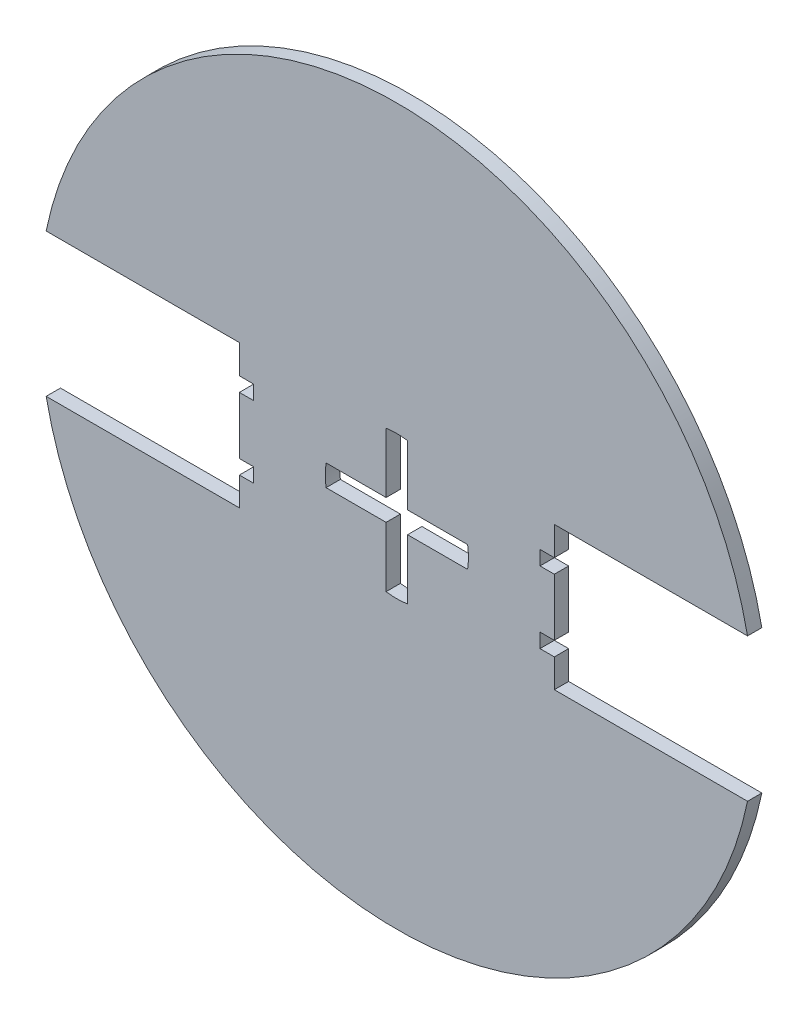
ISO-10303-21;
HEADER;
FILE_DESCRIPTION(('STEP AP214'),'2;1');
FILE_NAME('part.step','',(''),(''),'','','');
FILE_SCHEMA(('AUTOMOTIVE_DESIGN { 1 0 10303 214 1 1 1 1 }'));
ENDSEC;
DATA;
#1=APPLICATION_CONTEXT('core data for automotive mechanical design processes');
#2=APPLICATION_PROTOCOL_DEFINITION('international standard','automotive_design',2000,#1);
#3=PRODUCT_CONTEXT('',#1,'mechanical');
#4=PRODUCT('Part','Part','',(#3));
#5=PRODUCT_RELATED_PRODUCT_CATEGORY('part','',(#4));
#6=PRODUCT_DEFINITION_FORMATION('','',#4);
#7=PRODUCT_DEFINITION_CONTEXT('part definition',#1,'design');
#8=PRODUCT_DEFINITION('design','',#6,#7);
#9=PRODUCT_DEFINITION_SHAPE('','',#8);
#10=(LENGTH_UNIT() NAMED_UNIT(*) SI_UNIT(.MILLI.,.METRE.));
#11=(NAMED_UNIT(*) PLANE_ANGLE_UNIT() SI_UNIT($,.RADIAN.));
#12=(NAMED_UNIT(*) SI_UNIT($,.STERADIAN.) SOLID_ANGLE_UNIT());
#13=UNCERTAINTY_MEASURE_WITH_UNIT(LENGTH_MEASURE(1.E-05),#10,'distance_accuracy_value','');
#14=(GEOMETRIC_REPRESENTATION_CONTEXT(3) GLOBAL_UNCERTAINTY_ASSIGNED_CONTEXT((#13)) GLOBAL_UNIT_ASSIGNED_CONTEXT((#10,
#11,#12)) REPRESENTATION_CONTEXT('',''));
#15=CARTESIAN_POINT('',(0.,0.,0.));
#16=DIRECTION('',(0.,0.,1.));
#17=DIRECTION('',(1.,0.,0.));
#18=AXIS2_PLACEMENT_3D('',#15,#16,#17);
#19=CARTESIAN_POINT('',(22.,0.,-2.));
#20=DIRECTION('',(-1.,0.,0.));
#21=DIRECTION('',(0.,0.,1.));
#22=AXIS2_PLACEMENT_3D('',#19,#20,#21);
#23=PLANE('',#22);
#24=DIRECTION('',(0.,0.,1.));
#25=VECTOR('',#24,1.);
#26=CARTESIAN_POINT('',(22.,5.97280954344829,-2.));
#27=LINE('',#26,#25);
#28=CARTESIAN_POINT('',(22.,5.97280954344829,-2.));
#29=VERTEX_POINT('',#28);
#30=CARTESIAN_POINT('',(22.,5.97280954344829,0.));
#31=VERTEX_POINT('',#30);
#32=EDGE_CURVE('E531',#29,#31,#27,.T.);
#33=ORIENTED_EDGE('',*,*,#32,.F.);
#34=DIRECTION('',(0.,-1.,0.));
#35=VECTOR('',#34,1.);
#36=CARTESIAN_POINT('',(22.,0.,-2.));
#37=LINE('',#36,#35);
#38=CARTESIAN_POINT('',(22.,10.,-2.));
#39=VERTEX_POINT('',#38);
#40=EDGE_CURVE('E291',#39,#29,#37,.T.);
#41=ORIENTED_EDGE('',*,*,#40,.F.);
#42=DIRECTION('',(0.,0.,1.));
#43=VECTOR('',#42,1.);
#44=CARTESIAN_POINT('',(22.,10.,-2.));
#45=LINE('',#44,#43);
#46=CARTESIAN_POINT('',(22.,10.,0.));
#47=VERTEX_POINT('',#46);
#48=EDGE_CURVE('E372',#39,#47,#45,.T.);
#49=ORIENTED_EDGE('',*,*,#48,.T.);
#50=DIRECTION('',(0.,-1.,0.));
#51=VECTOR('',#50,1.);
#52=CARTESIAN_POINT('',(22.,0.,0.));
#53=LINE('',#52,#51);
#54=EDGE_CURVE('E354',#47,#31,#53,.T.);
#55=ORIENTED_EDGE('',*,*,#54,.T.);
#56=EDGE_LOOP('',(#33,#41,#49,#55));
#57=FACE_BOUND('',#56,.T.);
#58=ADVANCED_FACE('F38',(#57),#23,.F.);
#59=CARTESIAN_POINT('',(22.,3.97280954344829,-2.));
#60=VERTEX_POINT('',#59);
#61=CARTESIAN_POINT('',(22.,-4.02811773443487,-2.));
#62=VERTEX_POINT('',#61);
#63=EDGE_CURVE('E359',#60,#62,#37,.T.);
#64=ORIENTED_EDGE('',*,*,#63,.F.);
#65=DIRECTION('',(0.,0.,1.));
#66=VECTOR('',#65,1.);
#67=CARTESIAN_POINT('',(22.,3.97280954344829,-2.));
#68=LINE('',#67,#66);
#69=CARTESIAN_POINT('',(22.,3.97280954344829,0.));
#70=VERTEX_POINT('',#69);
#71=EDGE_CURVE('E533',#60,#70,#68,.T.);
#72=ORIENTED_EDGE('',*,*,#71,.T.);
#73=CARTESIAN_POINT('',(22.,-4.02811773443487,0.));
#74=VERTEX_POINT('',#73);
#75=EDGE_CURVE('E367',#70,#74,#53,.T.);
#76=ORIENTED_EDGE('',*,*,#75,.T.);
#77=DIRECTION('',(0.,0.,1.));
#78=VECTOR('',#77,1.);
#79=CARTESIAN_POINT('',(22.,-4.02811773443487,-2.));
#80=LINE('',#79,#78);
#81=EDGE_CURVE('E526',#62,#74,#80,.T.);
#82=ORIENTED_EDGE('',*,*,#81,.F.);
#83=EDGE_LOOP('',(#64,#72,#76,#82));
#84=FACE_BOUND('',#83,.T.);
#85=ADVANCED_FACE('F622',(#84),#23,.F.);
#86=CARTESIAN_POINT('',(-22.,0.,-2.));
#87=DIRECTION('',(-1.,0.,0.));
#88=DIRECTION('',(0.,0.,1.));
#89=AXIS2_PLACEMENT_3D('',#86,#87,#88);
#90=PLANE('',#89);
#91=DIRECTION('',(0.,-1.,0.));
#92=VECTOR('',#91,1.);
#93=CARTESIAN_POINT('',(-22.,0.,-2.));
#94=LINE('',#93,#92);
#95=CARTESIAN_POINT('',(-22.,10.,-2.));
#96=VERTEX_POINT('',#95);
#97=CARTESIAN_POINT('',(-22.,5.97280954344829,-2.));
#98=VERTEX_POINT('',#97);
#99=EDGE_CURVE('E469',#96,#98,#94,.T.);
#100=ORIENTED_EDGE('',*,*,#99,.T.);
#101=DIRECTION('',(0.,0.,1.));
#102=VECTOR('',#101,1.);
#103=CARTESIAN_POINT('',(-22.,5.97280954344829,0.));
#104=LINE('',#103,#102);
#105=CARTESIAN_POINT('',(-22.,5.97280954344829,0.));
#106=VERTEX_POINT('',#105);
#107=EDGE_CURVE('E325',#98,#106,#104,.T.);
#108=ORIENTED_EDGE('',*,*,#107,.T.);
#109=DIRECTION('',(0.,-1.,0.));
#110=VECTOR('',#109,1.);
#111=CARTESIAN_POINT('',(-22.,0.,0.));
#112=LINE('',#111,#110);
#113=CARTESIAN_POINT('',(-22.,10.,0.));
#114=VERTEX_POINT('',#113);
#115=EDGE_CURVE('E485',#114,#106,#112,.T.);
#116=ORIENTED_EDGE('',*,*,#115,.F.);
#117=DIRECTION('',(0.,0.,1.));
#118=VECTOR('',#117,1.);
#119=CARTESIAN_POINT('',(-22.,10.,-2.));
#120=LINE('',#119,#118);
#121=EDGE_CURVE('E499',#96,#114,#120,.T.);
#122=ORIENTED_EDGE('',*,*,#121,.F.);
#123=EDGE_LOOP('',(#100,#108,#116,#122));
#124=FACE_BOUND('',#123,.T.);
#125=ADVANCED_FACE('F604',(#124),#90,.T.);
#126=DIRECTION('',(0.,0.,1.));
#127=VECTOR('',#126,1.);
#128=CARTESIAN_POINT('',(-22.,3.97280954344829,0.));
#129=LINE('',#128,#127);
#130=CARTESIAN_POINT('',(-22.,3.97280954344829,-2.));
#131=VERTEX_POINT('',#130);
#132=CARTESIAN_POINT('',(-22.,3.97280954344829,0.));
#133=VERTEX_POINT('',#132);
#134=EDGE_CURVE('E320',#131,#133,#129,.T.);
#135=ORIENTED_EDGE('',*,*,#134,.F.);
#136=CARTESIAN_POINT('',(-22.,-4.02811773443487,-2.));
#137=VERTEX_POINT('',#136);
#138=EDGE_CURVE('E473',#131,#137,#94,.T.);
#139=ORIENTED_EDGE('',*,*,#138,.T.);
#140=DIRECTION('',(0.,0.,1.));
#141=VECTOR('',#140,1.);
#142=CARTESIAN_POINT('',(-22.,-4.02811773443487,0.));
#143=LINE('',#142,#141);
#144=CARTESIAN_POINT('',(-22.,-4.02811773443487,0.));
#145=VERTEX_POINT('',#144);
#146=EDGE_CURVE('E315',#137,#145,#143,.T.);
#147=ORIENTED_EDGE('',*,*,#146,.T.);
#148=EDGE_CURVE('E489',#133,#145,#112,.T.);
#149=ORIENTED_EDGE('',*,*,#148,.F.);
#150=EDGE_LOOP('',(#135,#139,#147,#149));
#151=FACE_BOUND('',#150,.T.);
#152=ADVANCED_FACE('F583',(#151),#90,.T.);
#153=CARTESIAN_POINT('',(0.,0.,-2.));
#154=DIRECTION('',(0.,0.,1.));
#155=DIRECTION('',(1.,0.,0.));
#156=AXIS2_PLACEMENT_3D('',#153,#154,#155);
#157=CYLINDRICAL_SURFACE('',#156,50.);
#158=CARTESIAN_POINT('',(0.,0.,0.));
#159=DIRECTION('',(0.,0.,1.));
#160=DIRECTION('',(1.,0.,0.));
#161=AXIS2_PLACEMENT_3D('',#158,#159,#160);
#162=CIRCLE('',#161,50.);
#163=CARTESIAN_POINT('',(48.9897948556636,10.,0.));
#164=VERTEX_POINT('',#163);
#165=CARTESIAN_POINT('',(-48.9897948556636,10.,0.));
#166=VERTEX_POINT('',#165);
#167=EDGE_CURVE('E492',#164,#166,#162,.T.);
#168=ORIENTED_EDGE('',*,*,#167,.F.);
#169=DIRECTION('',(0.,0.,1.));
#170=VECTOR('',#169,1.);
#171=CARTESIAN_POINT('',(48.9897948556636,10.,-2.));
#172=LINE('',#171,#170);
#173=CARTESIAN_POINT('',(48.9897948556636,10.,-2.));
#174=VERTEX_POINT('',#173);
#175=EDGE_CURVE('E374',#174,#164,#172,.T.);
#176=ORIENTED_EDGE('',*,*,#175,.F.);
#177=CARTESIAN_POINT('',(0.,0.,-2.));
#178=DIRECTION('',(0.,0.,1.));
#179=DIRECTION('',(1.,0.,0.));
#180=AXIS2_PLACEMENT_3D('',#177,#178,#179);
#181=CIRCLE('',#180,50.);
#182=CARTESIAN_POINT('',(-48.9897948556636,10.,-2.));
#183=VERTEX_POINT('',#182);
#184=EDGE_CURVE('E477',#174,#183,#181,.T.);
#185=ORIENTED_EDGE('',*,*,#184,.T.);
#186=DIRECTION('',(0.,0.,1.));
#187=VECTOR('',#186,1.);
#188=CARTESIAN_POINT('',(-48.9897948556636,10.,-2.));
#189=LINE('',#188,#187);
#190=EDGE_CURVE('E502',#183,#166,#189,.T.);
#191=ORIENTED_EDGE('',*,*,#190,.T.);
#192=EDGE_LOOP('',(#168,#176,#185,#191));
#193=FACE_BOUND('',#192,.T.);
#194=ADVANCED_FACE('F615',(#193),#157,.T.);
#195=DIRECTION('',(0.,0.,1.));
#196=VECTOR('',#195,1.);
#197=CARTESIAN_POINT('',(-22.,-6.02811773443487,0.));
#198=LINE('',#197,#196);
#199=CARTESIAN_POINT('',(-22.,-6.02811773443487,-2.));
#200=VERTEX_POINT('',#199);
#201=CARTESIAN_POINT('',(-22.,-6.02811773443487,0.));
#202=VERTEX_POINT('',#201);
#203=EDGE_CURVE('E339',#200,#202,#198,.T.);
#204=ORIENTED_EDGE('',*,*,#203,.F.);
#205=CARTESIAN_POINT('',(-22.,-10.,-2.));
#206=VERTEX_POINT('',#205);
#207=EDGE_CURVE('E474',#200,#206,#94,.T.);
#208=ORIENTED_EDGE('',*,*,#207,.T.);
#209=DIRECTION('',(0.,0.,1.));
#210=VECTOR('',#209,1.);
#211=CARTESIAN_POINT('',(-22.,-10.,-2.));
#212=LINE('',#211,#210);
#213=CARTESIAN_POINT('',(-22.,-10.,0.));
#214=VERTEX_POINT('',#213);
#215=EDGE_CURVE('E484',#206,#214,#212,.T.);
#216=ORIENTED_EDGE('',*,*,#215,.T.);
#217=EDGE_CURVE('E462',#202,#214,#112,.T.);
#218=ORIENTED_EDGE('',*,*,#217,.F.);
#219=EDGE_LOOP('',(#204,#208,#216,#218));
#220=FACE_BOUND('',#219,.T.);
#221=ADVANCED_FACE('F40',(#220),#90,.T.);
#222=CARTESIAN_POINT('',(0.,10.,-2.));
#223=DIRECTION('',(0.,1.,0.));
#224=DIRECTION('',(-1.,0.,0.));
#225=AXIS2_PLACEMENT_3D('',#222,#223,#224);
#226=PLANE('',#225);
#227=DIRECTION('',(-1.,0.,0.));
#228=VECTOR('',#227,1.);
#229=CARTESIAN_POINT('',(0.,10.,0.));
#230=LINE('',#229,#228);
#231=EDGE_CURVE('E496',#114,#166,#230,.T.);
#232=ORIENTED_EDGE('',*,*,#231,.T.);
#233=ORIENTED_EDGE('',*,*,#190,.F.);
#234=DIRECTION('',(-1.,0.,0.));
#235=VECTOR('',#234,1.);
#236=CARTESIAN_POINT('',(0.,10.,-2.));
#237=LINE('',#236,#235);
#238=EDGE_CURVE('E481',#96,#183,#237,.T.);
#239=ORIENTED_EDGE('',*,*,#238,.F.);
#240=ORIENTED_EDGE('',*,*,#121,.T.);
#241=EDGE_LOOP('',(#232,#233,#239,#240));
#242=FACE_BOUND('',#241,.T.);
#243=ADVANCED_FACE('F610',(#242),#226,.F.);
#244=DIRECTION('',(0.,0.,1.));
#245=VECTOR('',#244,1.);
#246=CARTESIAN_POINT('',(48.9897948556636,-10.,-2.));
#247=LINE('',#246,#245);
#248=CARTESIAN_POINT('',(48.9897948556636,-10.,-2.));
#249=VERTEX_POINT('',#248);
#250=CARTESIAN_POINT('',(48.9897948556636,-10.,0.));
#251=VERTEX_POINT('',#250);
#252=EDGE_CURVE('E358',#249,#251,#247,.T.);
#253=ORIENTED_EDGE('',*,*,#252,.T.);
#254=CARTESIAN_POINT('',(-48.9897948556636,-10.,0.));
#255=VERTEX_POINT('',#254);
#256=EDGE_CURVE('E493',#255,#251,#162,.T.);
#257=ORIENTED_EDGE('',*,*,#256,.F.);
#258=DIRECTION('',(0.,0.,1.));
#259=VECTOR('',#258,1.);
#260=CARTESIAN_POINT('',(-48.9897948556636,-10.,-2.));
#261=LINE('',#260,#259);
#262=CARTESIAN_POINT('',(-48.9897948556636,-10.,-2.));
#263=VERTEX_POINT('',#262);
#264=EDGE_CURVE('E505',#263,#255,#261,.T.);
#265=ORIENTED_EDGE('',*,*,#264,.F.);
#266=EDGE_CURVE('E478',#263,#249,#181,.T.);
#267=ORIENTED_EDGE('',*,*,#266,.T.);
#268=EDGE_LOOP('',(#253,#257,#265,#267));
#269=FACE_BOUND('',#268,.T.);
#270=ADVANCED_FACE('F566',(#269),#157,.T.);
#271=CARTESIAN_POINT('',(0.,-9.99999999999999,-2.));
#272=DIRECTION('',(0.,1.,0.));
#273=DIRECTION('',(-1.,0.,0.));
#274=AXIS2_PLACEMENT_3D('',#271,#272,#273);
#275=PLANE('',#274);
#276=DIRECTION('',(-1.,0.,0.));
#277=VECTOR('',#276,1.);
#278=CARTESIAN_POINT('',(0.,-9.99999999999999,0.));
#279=LINE('',#278,#277);
#280=EDGE_CURVE('E488',#214,#255,#279,.T.);
#281=ORIENTED_EDGE('',*,*,#280,.F.);
#282=ORIENTED_EDGE('',*,*,#215,.F.);
#283=DIRECTION('',(-1.,0.,0.));
#284=VECTOR('',#283,1.);
#285=CARTESIAN_POINT('',(0.,-9.99999999999999,-2.));
#286=LINE('',#285,#284);
#287=EDGE_CURVE('E472',#206,#263,#286,.T.);
#288=ORIENTED_EDGE('',*,*,#287,.T.);
#289=ORIENTED_EDGE('',*,*,#264,.T.);
#290=EDGE_LOOP('',(#281,#282,#288,#289));
#291=FACE_BOUND('',#290,.T.);
#292=ADVANCED_FACE('F572',(#291),#275,.T.);
#293=CARTESIAN_POINT('',(0.,0.,-2.));
#294=DIRECTION('',(0.,0.,1.));
#295=DIRECTION('',(1.,0.,0.));
#296=AXIS2_PLACEMENT_3D('',#293,#294,#295);
#297=PLANE('',#296);
#298=DIRECTION('',(0.,-1.,0.));
#299=VECTOR('',#298,1.);
#300=CARTESIAN_POINT('',(20.,0.,-2.));
#301=LINE('',#300,#299);
#302=CARTESIAN_POINT('',(20.,5.97280954344829,-2.));
#303=VERTEX_POINT('',#302);
#304=CARTESIAN_POINT('',(20.,3.97280954344829,-2.));
#305=VERTEX_POINT('',#304);
#306=EDGE_CURVE('E276',#303,#305,#301,.T.);
#307=ORIENTED_EDGE('',*,*,#306,.T.);
#308=DIRECTION('',(1.,0.,0.));
#309=VECTOR('',#308,1.);
#310=CARTESIAN_POINT('',(20.,3.97280954344829,-2.));
#311=LINE('',#310,#309);
#312=EDGE_CURVE('E292',#305,#60,#311,.T.);
#313=ORIENTED_EDGE('',*,*,#312,.T.);
#314=ORIENTED_EDGE('',*,*,#63,.T.);
#315=DIRECTION('',(1.,0.,0.));
#316=VECTOR('',#315,1.);
#317=CARTESIAN_POINT('',(20.,-4.02811773443487,-2.));
#318=LINE('',#317,#316);
#319=CARTESIAN_POINT('',(20.,-4.02811773443487,-2.));
#320=VERTEX_POINT('',#319);
#321=EDGE_CURVE('E53',#320,#62,#318,.T.);
#322=ORIENTED_EDGE('',*,*,#321,.F.);
#323=DIRECTION('',(0.,-1.,0.));
#324=VECTOR('',#323,1.);
#325=CARTESIAN_POINT('',(20.,0.,-2.));
#326=LINE('',#325,#324);
#327=CARTESIAN_POINT('',(20.,-6.02811773443487,-2.));
#328=VERTEX_POINT('',#327);
#329=EDGE_CURVE('E298',#320,#328,#326,.T.);
#330=ORIENTED_EDGE('',*,*,#329,.T.);
#331=DIRECTION('',(1.,0.,0.));
#332=VECTOR('',#331,1.);
#333=CARTESIAN_POINT('',(20.,-6.02811773443487,-2.));
#334=LINE('',#333,#332);
#335=CARTESIAN_POINT('',(22.,-6.02811773443487,-2.));
#336=VERTEX_POINT('',#335);
#337=EDGE_CURVE('E284',#328,#336,#334,.T.);
#338=ORIENTED_EDGE('',*,*,#337,.T.);
#339=CARTESIAN_POINT('',(22.,-10.,-2.));
#340=VERTEX_POINT('',#339);
#341=EDGE_CURVE('E356',#336,#340,#37,.T.);
#342=ORIENTED_EDGE('',*,*,#341,.T.);
#343=DIRECTION('',(1.,0.,0.));
#344=VECTOR('',#343,1.);
#345=CARTESIAN_POINT('',(0.,-10.,-2.));
#346=LINE('',#345,#344);
#347=EDGE_CURVE('E350',#340,#249,#346,.T.);
#348=ORIENTED_EDGE('',*,*,#347,.T.);
#349=ORIENTED_EDGE('',*,*,#266,.F.);
#350=ORIENTED_EDGE('',*,*,#287,.F.);
#351=ORIENTED_EDGE('',*,*,#207,.F.);
#352=DIRECTION('',(-1.,0.,0.));
#353=VECTOR('',#352,1.);
#354=CARTESIAN_POINT('',(-20.,-6.02811773443487,-2.));
#355=LINE('',#354,#353);
#356=CARTESIAN_POINT('',(-20.,-6.02811773443487,-2.));
#357=VERTEX_POINT('',#356);
#358=EDGE_CURVE('E328',#357,#200,#355,.T.);
#359=ORIENTED_EDGE('',*,*,#358,.F.);
#360=DIRECTION('',(0.,-1.,0.));
#361=VECTOR('',#360,1.);
#362=CARTESIAN_POINT('',(-20.,0.,-2.));
#363=LINE('',#362,#361);
#364=CARTESIAN_POINT('',(-20.,-4.02811773443487,-2.));
#365=VERTEX_POINT('',#364);
#366=EDGE_CURVE('E338',#365,#357,#363,.T.);
#367=ORIENTED_EDGE('',*,*,#366,.F.);
#368=DIRECTION('',(-1.,0.,0.));
#369=VECTOR('',#368,1.);
#370=CARTESIAN_POINT('',(-20.,-4.02811773443487,-2.));
#371=LINE('',#370,#369);
#372=EDGE_CURVE('E343',#365,#137,#371,.T.);
#373=ORIENTED_EDGE('',*,*,#372,.T.);
#374=ORIENTED_EDGE('',*,*,#138,.F.);
#375=DIRECTION('',(-1.,0.,0.));
#376=VECTOR('',#375,1.);
#377=CARTESIAN_POINT('',(-20.,3.97280954344829,-2.));
#378=LINE('',#377,#376);
#379=CARTESIAN_POINT('',(-20.,3.97280954344829,-2.));
#380=VERTEX_POINT('',#379);
#381=EDGE_CURVE('E330',#380,#131,#378,.T.);
#382=ORIENTED_EDGE('',*,*,#381,.F.);
#383=DIRECTION('',(0.,-1.,0.));
#384=VECTOR('',#383,1.);
#385=CARTESIAN_POINT('',(-20.,0.,-2.));
#386=LINE('',#385,#384);
#387=CARTESIAN_POINT('',(-20.,5.97280954344829,-2.));
#388=VERTEX_POINT('',#387);
#389=EDGE_CURVE('E319',#388,#380,#386,.T.);
#390=ORIENTED_EDGE('',*,*,#389,.F.);
#391=DIRECTION('',(-1.,0.,0.));
#392=VECTOR('',#391,1.);
#393=CARTESIAN_POINT('',(-20.,5.97280954344829,-2.));
#394=LINE('',#393,#392);
#395=EDGE_CURVE('E324',#388,#98,#394,.T.);
#396=ORIENTED_EDGE('',*,*,#395,.T.);
#397=ORIENTED_EDGE('',*,*,#99,.F.);
#398=ORIENTED_EDGE('',*,*,#238,.T.);
#399=ORIENTED_EDGE('',*,*,#184,.F.);
#400=DIRECTION('',(1.,0.,0.));
#401=VECTOR('',#400,1.);
#402=CARTESIAN_POINT('',(0.,10.,-2.));
#403=LINE('',#402,#401);
#404=EDGE_CURVE('E353',#39,#174,#403,.T.);
#405=ORIENTED_EDGE('',*,*,#404,.F.);
#406=ORIENTED_EDGE('',*,*,#40,.T.);
#407=DIRECTION('',(1.,0.,0.));
#408=VECTOR('',#407,1.);
#409=CARTESIAN_POINT('',(20.,5.97280954344829,-2.));
#410=LINE('',#409,#408);
#411=EDGE_CURVE('E61',#303,#29,#410,.T.);
#412=ORIENTED_EDGE('',*,*,#411,.F.);
#413=EDGE_LOOP('',(#307,#313,#314,#322,#330,#338,#342,#348,#349,#350,#351,#359,#367,#373,#374,
#382,#390,#396,#397,#398,#399,#405,#406,#412));
#414=FACE_BOUND('',#413,.T.);
#415=CARTESIAN_POINT('',(0.,0.,-2.));
#416=DIRECTION('',(0.,0.,-1.));
#417=DIRECTION('',(-1.,0.,0.));
#418=AXIS2_PLACEMENT_3D('',#415,#416,#417);
#419=CIRCLE('',#418,10.);
#420=CARTESIAN_POINT('',(9.88685996664259,1.5,-2.));
#421=VERTEX_POINT('',#420);
#422=CARTESIAN_POINT('',(9.88685996664259,-1.5,-2.));
#423=VERTEX_POINT('',#422);
#424=EDGE_CURVE('E404',#421,#423,#419,.T.);
#425=ORIENTED_EDGE('',*,*,#424,.F.);
#426=DIRECTION('',(1.,0.,0.));
#427=VECTOR('',#426,1.);
#428=CARTESIAN_POINT('',(0.,1.5,-2.));
#429=LINE('',#428,#427);
#430=CARTESIAN_POINT('',(1.5,1.5,-2.));
#431=VERTEX_POINT('',#430);
#432=EDGE_CURVE('E371',#431,#421,#429,.T.);
#433=ORIENTED_EDGE('',*,*,#432,.F.);
#434=DIRECTION('',(0.,1.,0.));
#435=VECTOR('',#434,1.);
#436=CARTESIAN_POINT('',(1.5,0.,-2.));
#437=LINE('',#436,#435);
#438=CARTESIAN_POINT('',(1.5,9.88685996664259,-2.));
#439=VERTEX_POINT('',#438);
#440=EDGE_CURVE('E446',#431,#439,#437,.T.);
#441=ORIENTED_EDGE('',*,*,#440,.T.);
#442=CARTESIAN_POINT('',(0.,0.,-2.));
#443=DIRECTION('',(0.,0.,-1.));
#444=DIRECTION('',(-1.,0.,0.));
#445=AXIS2_PLACEMENT_3D('',#442,#443,#444);
#446=CIRCLE('',#445,10.);
#447=CARTESIAN_POINT('',(-1.5,9.88685996664259,-2.));
#448=VERTEX_POINT('',#447);
#449=EDGE_CURVE('E454',#448,#439,#446,.T.);
#450=ORIENTED_EDGE('',*,*,#449,.F.);
#451=DIRECTION('',(0.,1.,0.));
#452=VECTOR('',#451,1.);
#453=CARTESIAN_POINT('',(-1.5,0.,-2.));
#454=LINE('',#453,#452);
#455=CARTESIAN_POINT('',(-1.5,1.5,-2.));
#456=VERTEX_POINT('',#455);
#457=EDGE_CURVE('E427',#456,#448,#454,.T.);
#458=ORIENTED_EDGE('',*,*,#457,.F.);
#459=CARTESIAN_POINT('',(-9.88685996664259,1.5,-2.));
#460=VERTEX_POINT('',#459);
#461=EDGE_CURVE('E402',#460,#456,#429,.T.);
#462=ORIENTED_EDGE('',*,*,#461,.F.);
#463=CARTESIAN_POINT('',(0.,0.,-2.));
#464=DIRECTION('',(0.,0.,-1.));
#465=DIRECTION('',(-1.,0.,0.));
#466=AXIS2_PLACEMENT_3D('',#463,#464,#465);
#467=CIRCLE('',#466,10.);
#468=CARTESIAN_POINT('',(-9.88685996664259,-1.5,-2.));
#469=VERTEX_POINT('',#468);
#470=EDGE_CURVE('E422',#469,#460,#467,.T.);
#471=ORIENTED_EDGE('',*,*,#470,.F.);
#472=DIRECTION('',(-1.,0.,0.));
#473=VECTOR('',#472,1.);
#474=CARTESIAN_POINT('',(0.,-1.5,-2.));
#475=LINE('',#474,#473);
#476=CARTESIAN_POINT('',(-1.5,-1.5,-2.));
#477=VERTEX_POINT('',#476);
#478=EDGE_CURVE('E419',#477,#469,#475,.T.);
#479=ORIENTED_EDGE('',*,*,#478,.F.);
#480=DIRECTION('',(0.,-1.,0.));
#481=VECTOR('',#480,1.);
#482=CARTESIAN_POINT('',(-1.5,0.,-2.));
#483=LINE('',#482,#481);
#484=CARTESIAN_POINT('',(-1.5,-9.88685996664259,-2.));
#485=VERTEX_POINT('',#484);
#486=EDGE_CURVE('E416',#477,#485,#483,.T.);
#487=ORIENTED_EDGE('',*,*,#486,.T.);
#488=CARTESIAN_POINT('',(0.,0.,-2.));
#489=DIRECTION('',(0.,0.,-1.));
#490=DIRECTION('',(-1.,0.,0.));
#491=AXIS2_PLACEMENT_3D('',#488,#489,#490);
#492=CIRCLE('',#491,10.);
#493=CARTESIAN_POINT('',(1.5,-9.88685996664259,-2.));
#494=VERTEX_POINT('',#493);
#495=EDGE_CURVE('E413',#494,#485,#492,.T.);
#496=ORIENTED_EDGE('',*,*,#495,.F.);
#497=DIRECTION('',(0.,-1.,0.));
#498=VECTOR('',#497,1.);
#499=CARTESIAN_POINT('',(1.5,0.,-2.));
#500=LINE('',#499,#498);
#501=CARTESIAN_POINT('',(1.5,-1.5,-2.));
#502=VERTEX_POINT('',#501);
#503=EDGE_CURVE('E410',#502,#494,#500,.T.);
#504=ORIENTED_EDGE('',*,*,#503,.F.);
#505=DIRECTION('',(1.,0.,0.));
#506=VECTOR('',#505,1.);
#507=CARTESIAN_POINT('',(0.,-1.5,-2.));
#508=LINE('',#507,#506);
#509=EDGE_CURVE('E407',#502,#423,#508,.T.);
#510=ORIENTED_EDGE('',*,*,#509,.T.);
#511=EDGE_LOOP('',(#425,#433,#441,#450,#458,#462,#471,#479,#487,#496,#504,#510));
#512=FACE_BOUND('',#511,.T.);
#513=ADVANCED_FACE('F287',(#414,#512),#297,.F.);
#514=CARTESIAN_POINT('',(0.,0.,0.));
#515=DIRECTION('',(0.,0.,1.));
#516=DIRECTION('',(1.,0.,0.));
#517=AXIS2_PLACEMENT_3D('',#514,#515,#516);
#518=PLANE('',#517);
#519=DIRECTION('',(1.,0.,0.));
#520=VECTOR('',#519,1.);
#521=CARTESIAN_POINT('',(0.,3.97280954344829,0.));
#522=LINE('',#521,#520);
#523=CARTESIAN_POINT('',(20.,3.97280954344829,0.));
#524=VERTEX_POINT('',#523);
#525=EDGE_CURVE('E313',#524,#70,#522,.T.);
#526=ORIENTED_EDGE('',*,*,#525,.F.);
#527=DIRECTION('',(0.,1.,0.));
#528=VECTOR('',#527,1.);
#529=CARTESIAN_POINT('',(20.,0.,0.));
#530=LINE('',#529,#528);
#531=CARTESIAN_POINT('',(20.,5.97280954344829,0.));
#532=VERTEX_POINT('',#531);
#533=EDGE_CURVE('E11',#524,#532,#530,.T.);
#534=ORIENTED_EDGE('',*,*,#533,.T.);
#535=DIRECTION('',(1.,0.,0.));
#536=VECTOR('',#535,1.);
#537=CARTESIAN_POINT('',(0.,5.97280954344829,0.));
#538=LINE('',#537,#536);
#539=EDGE_CURVE('E273',#532,#31,#538,.T.);
#540=ORIENTED_EDGE('',*,*,#539,.T.);
#541=ORIENTED_EDGE('',*,*,#54,.F.);
#542=DIRECTION('',(1.,0.,0.));
#543=VECTOR('',#542,1.);
#544=CARTESIAN_POINT('',(0.,10.,0.));
#545=LINE('',#544,#543);
#546=EDGE_CURVE('E361',#47,#164,#545,.T.);
#547=ORIENTED_EDGE('',*,*,#546,.T.);
#548=ORIENTED_EDGE('',*,*,#167,.T.);
#549=ORIENTED_EDGE('',*,*,#231,.F.);
#550=ORIENTED_EDGE('',*,*,#115,.T.);
#551=DIRECTION('',(1.,0.,0.));
#552=VECTOR('',#551,1.);
#553=CARTESIAN_POINT('',(0.,5.97280954344829,0.));
#554=LINE('',#553,#552);
#555=CARTESIAN_POINT('',(-20.,5.97280954344829,0.));
#556=VERTEX_POINT('',#555);
#557=EDGE_CURVE('E520',#106,#556,#554,.T.);
#558=ORIENTED_EDGE('',*,*,#557,.T.);
#559=DIRECTION('',(0.,-1.,0.));
#560=VECTOR('',#559,1.);
#561=CARTESIAN_POINT('',(-20.,0.,0.));
#562=LINE('',#561,#560);
#563=CARTESIAN_POINT('',(-20.,3.97280954344829,0.));
#564=VERTEX_POINT('',#563);
#565=EDGE_CURVE('E517',#556,#564,#562,.T.);
#566=ORIENTED_EDGE('',*,*,#565,.T.);
#567=DIRECTION('',(1.,0.,0.));
#568=VECTOR('',#567,1.);
#569=CARTESIAN_POINT('',(0.,3.97280954344829,0.));
#570=LINE('',#569,#568);
#571=EDGE_CURVE('E523',#133,#564,#570,.T.);
#572=ORIENTED_EDGE('',*,*,#571,.F.);
#573=ORIENTED_EDGE('',*,*,#148,.T.);
#574=DIRECTION('',(1.,0.,0.));
#575=VECTOR('',#574,1.);
#576=CARTESIAN_POINT('',(0.,-4.02811773443487,0.));
#577=LINE('',#576,#575);
#578=CARTESIAN_POINT('',(-20.,-4.02811773443487,0.));
#579=VERTEX_POINT('',#578);
#580=EDGE_CURVE('E511',#145,#579,#577,.T.);
#581=ORIENTED_EDGE('',*,*,#580,.T.);
#582=DIRECTION('',(0.,-1.,0.));
#583=VECTOR('',#582,1.);
#584=CARTESIAN_POINT('',(-20.,0.,0.));
#585=LINE('',#584,#583);
#586=CARTESIAN_POINT('',(-20.,-6.02811773443487,0.));
#587=VERTEX_POINT('',#586);
#588=EDGE_CURVE('E501',#579,#587,#585,.T.);
#589=ORIENTED_EDGE('',*,*,#588,.T.);
#590=DIRECTION('',(1.,0.,0.));
#591=VECTOR('',#590,1.);
#592=CARTESIAN_POINT('',(0.,-6.02811773443487,0.));
#593=LINE('',#592,#591);
#594=EDGE_CURVE('E514',#202,#587,#593,.T.);
#595=ORIENTED_EDGE('',*,*,#594,.F.);
#596=ORIENTED_EDGE('',*,*,#217,.T.);
#597=ORIENTED_EDGE('',*,*,#280,.T.);
#598=ORIENTED_EDGE('',*,*,#256,.T.);
#599=DIRECTION('',(1.,0.,0.));
#600=VECTOR('',#599,1.);
#601=CARTESIAN_POINT('',(0.,-10.,0.));
#602=LINE('',#601,#600);
#603=CARTESIAN_POINT('',(22.,-10.,0.));
#604=VERTEX_POINT('',#603);
#605=EDGE_CURVE('E332',#604,#251,#602,.T.);
#606=ORIENTED_EDGE('',*,*,#605,.F.);
#607=CARTESIAN_POINT('',(22.,-6.02811773443487,0.));
#608=VERTEX_POINT('',#607);
#609=EDGE_CURVE('E364',#608,#604,#53,.T.);
#610=ORIENTED_EDGE('',*,*,#609,.F.);
#611=DIRECTION('',(1.,0.,0.));
#612=VECTOR('',#611,1.);
#613=CARTESIAN_POINT('',(0.,-6.02811773443487,0.));
#614=LINE('',#613,#612);
#615=CARTESIAN_POINT('',(20.,-6.02811773443487,0.));
#616=VERTEX_POINT('',#615);
#617=EDGE_CURVE('E310',#616,#608,#614,.T.);
#618=ORIENTED_EDGE('',*,*,#617,.F.);
#619=DIRECTION('',(0.,1.,0.));
#620=VECTOR('',#619,1.);
#621=CARTESIAN_POINT('',(20.,0.,0.));
#622=LINE('',#621,#620);
#623=CARTESIAN_POINT('',(20.,-4.02811773443487,0.));
#624=VERTEX_POINT('',#623);
#625=EDGE_CURVE('E46',#616,#624,#622,.T.);
#626=ORIENTED_EDGE('',*,*,#625,.T.);
#627=DIRECTION('',(1.,0.,0.));
#628=VECTOR('',#627,1.);
#629=CARTESIAN_POINT('',(0.,-4.02811773443487,0.));
#630=LINE('',#629,#628);
#631=EDGE_CURVE('E294',#624,#74,#630,.T.);
#632=ORIENTED_EDGE('',*,*,#631,.T.);
#633=ORIENTED_EDGE('',*,*,#75,.F.);
#634=EDGE_LOOP('',(#526,#534,#540,#541,#547,#548,#549,#550,#558,#566,#572,#573,#581,#589,#595,
#596,#597,#598,#606,#610,#618,#626,#632,#633));
#635=FACE_BOUND('',#634,.T.);
#636=DIRECTION('',(1.,0.,0.));
#637=VECTOR('',#636,1.);
#638=CARTESIAN_POINT('',(0.,1.5,0.));
#639=LINE('',#638,#637);
#640=CARTESIAN_POINT('',(1.5,1.5,0.));
#641=VERTEX_POINT('',#640);
#642=CARTESIAN_POINT('',(9.88685996664259,1.5,0.));
#643=VERTEX_POINT('',#642);
#644=EDGE_CURVE('E382',#641,#643,#639,.T.);
#645=ORIENTED_EDGE('',*,*,#644,.T.);
#646=CARTESIAN_POINT('',(0.,0.,0.));
#647=DIRECTION('',(0.,0.,-1.));
#648=DIRECTION('',(-1.,0.,0.));
#649=AXIS2_PLACEMENT_3D('',#646,#647,#648);
#650=CIRCLE('',#649,10.);
#651=CARTESIAN_POINT('',(9.88685996664259,-1.5,0.));
#652=VERTEX_POINT('',#651);
#653=EDGE_CURVE('E381',#643,#652,#650,.T.);
#654=ORIENTED_EDGE('',*,*,#653,.T.);
#655=DIRECTION('',(1.,0.,0.));
#656=VECTOR('',#655,1.);
#657=CARTESIAN_POINT('',(0.,-1.5,0.));
#658=LINE('',#657,#656);
#659=CARTESIAN_POINT('',(1.5,-1.5,0.));
#660=VERTEX_POINT('',#659);
#661=EDGE_CURVE('E385',#660,#652,#658,.T.);
#662=ORIENTED_EDGE('',*,*,#661,.F.);
#663=DIRECTION('',(0.,-1.,0.));
#664=VECTOR('',#663,1.);
#665=CARTESIAN_POINT('',(1.5,0.,0.));
#666=LINE('',#665,#664);
#667=CARTESIAN_POINT('',(1.5,-9.88685996664259,0.));
#668=VERTEX_POINT('',#667);
#669=EDGE_CURVE('E387',#660,#668,#666,.T.);
#670=ORIENTED_EDGE('',*,*,#669,.T.);
#671=CARTESIAN_POINT('',(0.,0.,0.));
#672=DIRECTION('',(0.,0.,-1.));
#673=DIRECTION('',(-1.,0.,0.));
#674=AXIS2_PLACEMENT_3D('',#671,#672,#673);
#675=CIRCLE('',#674,10.);
#676=CARTESIAN_POINT('',(-1.5,-9.88685996664259,0.));
#677=VERTEX_POINT('',#676);
#678=EDGE_CURVE('E390',#668,#677,#675,.T.);
#679=ORIENTED_EDGE('',*,*,#678,.T.);
#680=DIRECTION('',(0.,-1.,0.));
#681=VECTOR('',#680,1.);
#682=CARTESIAN_POINT('',(-1.5,0.,0.));
#683=LINE('',#682,#681);
#684=CARTESIAN_POINT('',(-1.5,-1.5,0.));
#685=VERTEX_POINT('',#684);
#686=EDGE_CURVE('E393',#685,#677,#683,.T.);
#687=ORIENTED_EDGE('',*,*,#686,.F.);
#688=DIRECTION('',(-1.,0.,0.));
#689=VECTOR('',#688,1.);
#690=CARTESIAN_POINT('',(0.,-1.5,0.));
#691=LINE('',#690,#689);
#692=CARTESIAN_POINT('',(-9.88685996664259,-1.5,0.));
#693=VERTEX_POINT('',#692);
#694=EDGE_CURVE('E395',#685,#693,#691,.T.);
#695=ORIENTED_EDGE('',*,*,#694,.T.);
#696=CARTESIAN_POINT('',(0.,0.,0.));
#697=DIRECTION('',(0.,0.,-1.));
#698=DIRECTION('',(-1.,0.,0.));
#699=AXIS2_PLACEMENT_3D('',#696,#697,#698);
#700=CIRCLE('',#699,10.);
#701=CARTESIAN_POINT('',(-9.88685996664259,1.5,0.));
#702=VERTEX_POINT('',#701);
#703=EDGE_CURVE('E398',#693,#702,#700,.T.);
#704=ORIENTED_EDGE('',*,*,#703,.T.);
#705=CARTESIAN_POINT('',(-1.5,1.5,0.));
#706=VERTEX_POINT('',#705);
#707=EDGE_CURVE('E378',#702,#706,#639,.T.);
#708=ORIENTED_EDGE('',*,*,#707,.T.);
#709=DIRECTION('',(0.,1.,0.));
#710=VECTOR('',#709,1.);
#711=CARTESIAN_POINT('',(-1.5,0.,0.));
#712=LINE('',#711,#710);
#713=CARTESIAN_POINT('',(-1.5,9.88685996664259,0.));
#714=VERTEX_POINT('',#713);
#715=EDGE_CURVE('E442',#706,#714,#712,.T.);
#716=ORIENTED_EDGE('',*,*,#715,.T.);
#717=CARTESIAN_POINT('',(0.,0.,0.));
#718=DIRECTION('',(0.,0.,-1.));
#719=DIRECTION('',(-1.,0.,0.));
#720=AXIS2_PLACEMENT_3D('',#717,#718,#719);
#721=CIRCLE('',#720,10.);
#722=CARTESIAN_POINT('',(1.5,9.88685996664259,0.));
#723=VERTEX_POINT('',#722);
#724=EDGE_CURVE('E445',#714,#723,#721,.T.);
#725=ORIENTED_EDGE('',*,*,#724,.T.);
#726=DIRECTION('',(0.,1.,0.));
#727=VECTOR('',#726,1.);
#728=CARTESIAN_POINT('',(1.5,0.,0.));
#729=LINE('',#728,#727);
#730=EDGE_CURVE('E449',#641,#723,#729,.T.);
#731=ORIENTED_EDGE('',*,*,#730,.F.);
#732=EDGE_LOOP('',(#645,#654,#662,#670,#679,#687,#695,#704,#708,#716,#725,#731));
#733=FACE_BOUND('',#732,.T.);
#734=ADVANCED_FACE('F539',(#635,#733),#518,.T.);
#735=CARTESIAN_POINT('',(-1.5,0.,0.));
#736=DIRECTION('',(-1.,0.,0.));
#737=DIRECTION('',(0.,-1.,0.));
#738=AXIS2_PLACEMENT_3D('',#735,#736,#737);
#739=PLANE('',#738);
#740=ORIENTED_EDGE('',*,*,#457,.T.);
#741=DIRECTION('',(0.,0.,-1.));
#742=VECTOR('',#741,1.);
#743=CARTESIAN_POINT('',(-1.5,9.88685996664259,0.));
#744=LINE('',#743,#742);
#745=EDGE_CURVE('E452',#714,#448,#744,.T.);
#746=ORIENTED_EDGE('',*,*,#745,.F.);
#747=ORIENTED_EDGE('',*,*,#715,.F.);
#748=DIRECTION('',(0.,0.,-1.));
#749=VECTOR('',#748,1.);
#750=CARTESIAN_POINT('',(-1.5,1.5,0.));
#751=LINE('',#750,#749);
#752=EDGE_CURVE('E459',#706,#456,#751,.T.);
#753=ORIENTED_EDGE('',*,*,#752,.T.);
#754=EDGE_LOOP('',(#740,#746,#747,#753));
#755=FACE_BOUND('',#754,.T.);
#756=ADVANCED_FACE('F676',(#755),#739,.F.);
#757=CARTESIAN_POINT('',(1.5,0.,0.));
#758=DIRECTION('',(-1.,0.,0.));
#759=DIRECTION('',(0.,-1.,0.));
#760=AXIS2_PLACEMENT_3D('',#757,#758,#759);
#761=PLANE('',#760);
#762=ORIENTED_EDGE('',*,*,#440,.F.);
#763=DIRECTION('',(0.,0.,-1.));
#764=VECTOR('',#763,1.);
#765=CARTESIAN_POINT('',(1.5,1.5,0.));
#766=LINE('',#765,#764);
#767=EDGE_CURVE('E463',#641,#431,#766,.T.);
#768=ORIENTED_EDGE('',*,*,#767,.F.);
#769=ORIENTED_EDGE('',*,*,#730,.T.);
#770=DIRECTION('',(0.,0.,-1.));
#771=VECTOR('',#770,1.);
#772=CARTESIAN_POINT('',(1.5,9.88685996664259,0.));
#773=LINE('',#772,#771);
#774=EDGE_CURVE('E465',#723,#439,#773,.T.);
#775=ORIENTED_EDGE('',*,*,#774,.T.);
#776=EDGE_LOOP('',(#762,#768,#769,#775));
#777=FACE_BOUND('',#776,.T.);
#778=ADVANCED_FACE('F672',(#777),#761,.T.);
#779=CARTESIAN_POINT('',(0.,0.,0.));
#780=DIRECTION('',(0.,0.,-1.));
#781=DIRECTION('',(-1.,0.,0.));
#782=AXIS2_PLACEMENT_3D('',#779,#780,#781);
#783=CYLINDRICAL_SURFACE('',#782,10.);
#784=ORIENTED_EDGE('',*,*,#449,.T.);
#785=ORIENTED_EDGE('',*,*,#774,.F.);
#786=ORIENTED_EDGE('',*,*,#724,.F.);
#787=ORIENTED_EDGE('',*,*,#745,.T.);
#788=EDGE_LOOP('',(#784,#785,#786,#787));
#789=FACE_BOUND('',#788,.T.);
#790=ADVANCED_FACE('F675',(#789),#783,.F.);
#791=CARTESIAN_POINT('',(0.,1.5,0.));
#792=DIRECTION('',(0.,1.,0.));
#793=DIRECTION('',(-1.,0.,0.));
#794=AXIS2_PLACEMENT_3D('',#791,#792,#793);
#795=PLANE('',#794);
#796=ORIENTED_EDGE('',*,*,#707,.F.);
#797=DIRECTION('',(0.,0.,-1.));
#798=VECTOR('',#797,1.);
#799=CARTESIAN_POINT('',(-9.88685996664259,1.5,0.));
#800=LINE('',#799,#798);
#801=EDGE_CURVE('E425',#702,#460,#800,.T.);
#802=ORIENTED_EDGE('',*,*,#801,.T.);
#803=ORIENTED_EDGE('',*,*,#461,.T.);
#804=ORIENTED_EDGE('',*,*,#752,.F.);
#805=EDGE_LOOP('',(#796,#802,#803,#804));
#806=FACE_BOUND('',#805,.T.);
#807=ADVANCED_FACE('F670',(#806),#795,.F.);
#808=ORIENTED_EDGE('',*,*,#767,.T.);
#809=ORIENTED_EDGE('',*,*,#432,.T.);
#810=DIRECTION('',(0.,0.,-1.));
#811=VECTOR('',#810,1.);
#812=CARTESIAN_POINT('',(9.88685996664259,1.5,0.));
#813=LINE('',#812,#811);
#814=EDGE_CURVE('E401',#643,#421,#813,.T.);
#815=ORIENTED_EDGE('',*,*,#814,.F.);
#816=ORIENTED_EDGE('',*,*,#644,.F.);
#817=EDGE_LOOP('',(#808,#809,#815,#816));
#818=FACE_BOUND('',#817,.T.);
#819=ADVANCED_FACE('F648',(#818),#795,.F.);
#820=CARTESIAN_POINT('',(0.,0.,0.));
#821=DIRECTION('',(0.,0.,-1.));
#822=DIRECTION('',(-1.,0.,0.));
#823=AXIS2_PLACEMENT_3D('',#820,#821,#822);
#824=CYLINDRICAL_SURFACE('',#823,10.);
#825=ORIENTED_EDGE('',*,*,#470,.T.);
#826=ORIENTED_EDGE('',*,*,#801,.F.);
#827=ORIENTED_EDGE('',*,*,#703,.F.);
#828=DIRECTION('',(0.,0.,-1.));
#829=VECTOR('',#828,1.);
#830=CARTESIAN_POINT('',(-9.88685996664259,-1.5,0.));
#831=LINE('',#830,#829);
#832=EDGE_CURVE('E428',#693,#469,#831,.T.);
#833=ORIENTED_EDGE('',*,*,#832,.T.);
#834=EDGE_LOOP('',(#825,#826,#827,#833));
#835=FACE_BOUND('',#834,.T.);
#836=ADVANCED_FACE('F644',(#835),#824,.F.);
#837=CARTESIAN_POINT('',(0.,-1.5,0.));
#838=DIRECTION('',(0.,-1.,0.));
#839=DIRECTION('',(1.,0.,0.));
#840=AXIS2_PLACEMENT_3D('',#837,#838,#839);
#841=PLANE('',#840);
#842=ORIENTED_EDGE('',*,*,#478,.T.);
#843=ORIENTED_EDGE('',*,*,#832,.F.);
#844=ORIENTED_EDGE('',*,*,#694,.F.);
#845=DIRECTION('',(0.,0.,-1.));
#846=VECTOR('',#845,1.);
#847=CARTESIAN_POINT('',(-1.5,-1.5,0.));
#848=LINE('',#847,#846);
#849=EDGE_CURVE('E430',#685,#477,#848,.T.);
#850=ORIENTED_EDGE('',*,*,#849,.T.);
#851=EDGE_LOOP('',(#842,#843,#844,#850));
#852=FACE_BOUND('',#851,.T.);
#853=ADVANCED_FACE('F647',(#852),#841,.F.);
#854=CARTESIAN_POINT('',(-1.5,0.,0.));
#855=DIRECTION('',(1.,0.,0.));
#856=DIRECTION('',(0.,1.,0.));
#857=AXIS2_PLACEMENT_3D('',#854,#855,#856);
#858=PLANE('',#857);
#859=ORIENTED_EDGE('',*,*,#486,.F.);
#860=ORIENTED_EDGE('',*,*,#849,.F.);
#861=ORIENTED_EDGE('',*,*,#686,.T.);
#862=DIRECTION('',(0.,0.,-1.));
#863=VECTOR('',#862,1.);
#864=CARTESIAN_POINT('',(-1.5,-9.88685996664259,0.));
#865=LINE('',#864,#863);
#866=EDGE_CURVE('E432',#677,#485,#865,.T.);
#867=ORIENTED_EDGE('',*,*,#866,.T.);
#868=EDGE_LOOP('',(#859,#860,#861,#867));
#869=FACE_BOUND('',#868,.T.);
#870=ADVANCED_FACE('F652',(#869),#858,.T.);
#871=CARTESIAN_POINT('',(0.,0.,0.));
#872=DIRECTION('',(0.,0.,-1.));
#873=DIRECTION('',(-1.,0.,0.));
#874=AXIS2_PLACEMENT_3D('',#871,#872,#873);
#875=CYLINDRICAL_SURFACE('',#874,10.);
#876=ORIENTED_EDGE('',*,*,#495,.T.);
#877=ORIENTED_EDGE('',*,*,#866,.F.);
#878=ORIENTED_EDGE('',*,*,#678,.F.);
#879=DIRECTION('',(0.,0.,-1.));
#880=VECTOR('',#879,1.);
#881=CARTESIAN_POINT('',(1.5,-9.88685996664259,0.));
#882=LINE('',#881,#880);
#883=EDGE_CURVE('E434',#668,#494,#882,.T.);
#884=ORIENTED_EDGE('',*,*,#883,.T.);
#885=EDGE_LOOP('',(#876,#877,#878,#884));
#886=FACE_BOUND('',#885,.T.);
#887=ADVANCED_FACE('F656',(#886),#875,.F.);
#888=CARTESIAN_POINT('',(1.5,0.,0.));
#889=DIRECTION('',(1.,0.,0.));
#890=DIRECTION('',(0.,1.,0.));
#891=AXIS2_PLACEMENT_3D('',#888,#889,#890);
#892=PLANE('',#891);
#893=ORIENTED_EDGE('',*,*,#503,.T.);
#894=ORIENTED_EDGE('',*,*,#883,.F.);
#895=ORIENTED_EDGE('',*,*,#669,.F.);
#896=DIRECTION('',(0.,0.,-1.));
#897=VECTOR('',#896,1.);
#898=CARTESIAN_POINT('',(1.5,-1.5,0.));
#899=LINE('',#898,#897);
#900=EDGE_CURVE('E436',#660,#502,#899,.T.);
#901=ORIENTED_EDGE('',*,*,#900,.T.);
#902=EDGE_LOOP('',(#893,#894,#895,#901));
#903=FACE_BOUND('',#902,.T.);
#904=ADVANCED_FACE('F660',(#903),#892,.F.);
#905=CARTESIAN_POINT('',(0.,-1.5,0.));
#906=DIRECTION('',(0.,1.,0.));
#907=DIRECTION('',(-1.,0.,0.));
#908=AXIS2_PLACEMENT_3D('',#905,#906,#907);
#909=PLANE('',#908);
#910=ORIENTED_EDGE('',*,*,#509,.F.);
#911=ORIENTED_EDGE('',*,*,#900,.F.);
#912=ORIENTED_EDGE('',*,*,#661,.T.);
#913=DIRECTION('',(0.,0.,-1.));
#914=VECTOR('',#913,1.);
#915=CARTESIAN_POINT('',(9.88685996664259,-1.5,0.));
#916=LINE('',#915,#914);
#917=EDGE_CURVE('E438',#652,#423,#916,.T.);
#918=ORIENTED_EDGE('',*,*,#917,.T.);
#919=EDGE_LOOP('',(#910,#911,#912,#918));
#920=FACE_BOUND('',#919,.T.);
#921=ADVANCED_FACE('F640',(#920),#909,.T.);
#922=CARTESIAN_POINT('',(0.,0.,0.));
#923=DIRECTION('',(0.,0.,-1.));
#924=DIRECTION('',(-1.,0.,0.));
#925=AXIS2_PLACEMENT_3D('',#922,#923,#924);
#926=CYLINDRICAL_SURFACE('',#925,10.);
#927=ORIENTED_EDGE('',*,*,#424,.T.);
#928=ORIENTED_EDGE('',*,*,#917,.F.);
#929=ORIENTED_EDGE('',*,*,#653,.F.);
#930=ORIENTED_EDGE('',*,*,#814,.T.);
#931=EDGE_LOOP('',(#927,#928,#929,#930));
#932=FACE_BOUND('',#931,.T.);
#933=ADVANCED_FACE('F635',(#932),#926,.F.);
#934=CARTESIAN_POINT('',(0.,-10.,-2.));
#935=DIRECTION('',(0.,-1.,0.));
#936=DIRECTION('',(0.,0.,-1.));
#937=AXIS2_PLACEMENT_3D('',#934,#935,#936);
#938=PLANE('',#937);
#939=ORIENTED_EDGE('',*,*,#605,.T.);
#940=ORIENTED_EDGE('',*,*,#252,.F.);
#941=ORIENTED_EDGE('',*,*,#347,.F.);
#942=DIRECTION('',(0.,0.,1.));
#943=VECTOR('',#942,1.);
#944=CARTESIAN_POINT('',(22.,-10.,-2.));
#945=LINE('',#944,#943);
#946=EDGE_CURVE('E368',#340,#604,#945,.T.);
#947=ORIENTED_EDGE('',*,*,#946,.T.);
#948=EDGE_LOOP('',(#939,#940,#941,#947));
#949=FACE_BOUND('',#948,.T.);
#950=ADVANCED_FACE('F563',(#949),#938,.F.);
#951=ORIENTED_EDGE('',*,*,#341,.F.);
#952=DIRECTION('',(0.,0.,1.));
#953=VECTOR('',#952,1.);
#954=CARTESIAN_POINT('',(22.,-6.02811773443487,-2.));
#955=LINE('',#954,#953);
#956=EDGE_CURVE('E528',#336,#608,#955,.T.);
#957=ORIENTED_EDGE('',*,*,#956,.T.);
#958=ORIENTED_EDGE('',*,*,#609,.T.);
#959=ORIENTED_EDGE('',*,*,#946,.F.);
#960=EDGE_LOOP('',(#951,#957,#958,#959));
#961=FACE_BOUND('',#960,.T.);
#962=ADVANCED_FACE('F560',(#961),#23,.F.);
#963=CARTESIAN_POINT('',(0.,10.,-2.));
#964=DIRECTION('',(0.,-1.,0.));
#965=DIRECTION('',(0.,0.,-1.));
#966=AXIS2_PLACEMENT_3D('',#963,#964,#965);
#967=PLANE('',#966);
#968=ORIENTED_EDGE('',*,*,#546,.F.);
#969=ORIENTED_EDGE('',*,*,#48,.F.);
#970=ORIENTED_EDGE('',*,*,#404,.T.);
#971=ORIENTED_EDGE('',*,*,#175,.T.);
#972=EDGE_LOOP('',(#968,#969,#970,#971));
#973=FACE_BOUND('',#972,.T.);
#974=ADVANCED_FACE('F618',(#973),#967,.T.);
#975=CARTESIAN_POINT('',(-20.,-6.02811773443487,0.));
#976=DIRECTION('',(0.,-1.,0.));
#977=DIRECTION('',(0.,0.,-1.));
#978=AXIS2_PLACEMENT_3D('',#975,#976,#977);
#979=PLANE('',#978);
#980=ORIENTED_EDGE('',*,*,#594,.T.);
#981=DIRECTION('',(0.,0.,1.));
#982=VECTOR('',#981,1.);
#983=CARTESIAN_POINT('',(-20.,-6.02811773443487,0.));
#984=LINE('',#983,#982);
#985=EDGE_CURVE('E341',#357,#587,#984,.T.);
#986=ORIENTED_EDGE('',*,*,#985,.F.);
#987=ORIENTED_EDGE('',*,*,#358,.T.);
#988=ORIENTED_EDGE('',*,*,#203,.T.);
#989=EDGE_LOOP('',(#980,#986,#987,#988));
#990=FACE_BOUND('',#989,.T.);
#991=ADVANCED_FACE('F634',(#990),#979,.F.);
#992=CARTESIAN_POINT('',(-20.,-4.02811773443487,0.));
#993=DIRECTION('',(0.,-1.,0.));
#994=DIRECTION('',(0.,0.,-1.));
#995=AXIS2_PLACEMENT_3D('',#992,#993,#994);
#996=PLANE('',#995);
#997=ORIENTED_EDGE('',*,*,#146,.F.);
#998=ORIENTED_EDGE('',*,*,#372,.F.);
#999=DIRECTION('',(0.,0.,1.));
#1000=VECTOR('',#999,1.);
#1001=CARTESIAN_POINT('',(-20.,-4.02811773443487,0.));
#1002=LINE('',#1001,#1000);
#1003=EDGE_CURVE('E335',#365,#579,#1002,.T.);
#1004=ORIENTED_EDGE('',*,*,#1003,.T.);
#1005=ORIENTED_EDGE('',*,*,#580,.F.);
#1006=EDGE_LOOP('',(#997,#998,#1004,#1005));
#1007=FACE_BOUND('',#1006,.T.);
#1008=ADVANCED_FACE('F590',(#1007),#996,.T.);
#1009=CARTESIAN_POINT('',(-20.,0.,0.));
#1010=DIRECTION('',(-1.,0.,0.));
#1011=DIRECTION('',(0.,0.,1.));
#1012=AXIS2_PLACEMENT_3D('',#1009,#1010,#1011);
#1013=PLANE('',#1012);
#1014=ORIENTED_EDGE('',*,*,#1003,.F.);
#1015=ORIENTED_EDGE('',*,*,#366,.T.);
#1016=ORIENTED_EDGE('',*,*,#985,.T.);
#1017=ORIENTED_EDGE('',*,*,#588,.F.);
#1018=EDGE_LOOP('',(#1014,#1015,#1016,#1017));
#1019=FACE_BOUND('',#1018,.T.);
#1020=ADVANCED_FACE('F592',(#1019),#1013,.T.);
#1021=CARTESIAN_POINT('',(-20.,3.97280954344829,0.));
#1022=DIRECTION('',(0.,-1.,0.));
#1023=DIRECTION('',(0.,0.,-1.));
#1024=AXIS2_PLACEMENT_3D('',#1021,#1022,#1023);
#1025=PLANE('',#1024);
#1026=ORIENTED_EDGE('',*,*,#571,.T.);
#1027=DIRECTION('',(0.,0.,1.));
#1028=VECTOR('',#1027,1.);
#1029=CARTESIAN_POINT('',(-20.,3.97280954344829,0.));
#1030=LINE('',#1029,#1028);
#1031=EDGE_CURVE('E322',#380,#564,#1030,.T.);
#1032=ORIENTED_EDGE('',*,*,#1031,.F.);
#1033=ORIENTED_EDGE('',*,*,#381,.T.);
#1034=ORIENTED_EDGE('',*,*,#134,.T.);
#1035=EDGE_LOOP('',(#1026,#1032,#1033,#1034));
#1036=FACE_BOUND('',#1035,.T.);
#1037=ADVANCED_FACE('F597',(#1036),#1025,.F.);
#1038=CARTESIAN_POINT('',(-20.,5.97280954344829,0.));
#1039=DIRECTION('',(0.,-1.,0.));
#1040=DIRECTION('',(0.,0.,-1.));
#1041=AXIS2_PLACEMENT_3D('',#1038,#1039,#1040);
#1042=PLANE('',#1041);
#1043=ORIENTED_EDGE('',*,*,#107,.F.);
#1044=ORIENTED_EDGE('',*,*,#395,.F.);
#1045=DIRECTION('',(0.,0.,1.));
#1046=VECTOR('',#1045,1.);
#1047=CARTESIAN_POINT('',(-20.,5.97280954344829,0.));
#1048=LINE('',#1047,#1046);
#1049=EDGE_CURVE('E316',#388,#556,#1048,.T.);
#1050=ORIENTED_EDGE('',*,*,#1049,.T.);
#1051=ORIENTED_EDGE('',*,*,#557,.F.);
#1052=EDGE_LOOP('',(#1043,#1044,#1050,#1051));
#1053=FACE_BOUND('',#1052,.T.);
#1054=ADVANCED_FACE('F836',(#1053),#1042,.T.);
#1055=CARTESIAN_POINT('',(-20.,0.,0.));
#1056=DIRECTION('',(-1.,0.,0.));
#1057=DIRECTION('',(0.,0.,1.));
#1058=AXIS2_PLACEMENT_3D('',#1055,#1056,#1057);
#1059=PLANE('',#1058);
#1060=ORIENTED_EDGE('',*,*,#1049,.F.);
#1061=ORIENTED_EDGE('',*,*,#389,.T.);
#1062=ORIENTED_EDGE('',*,*,#1031,.T.);
#1063=ORIENTED_EDGE('',*,*,#565,.F.);
#1064=EDGE_LOOP('',(#1060,#1061,#1062,#1063));
#1065=FACE_BOUND('',#1064,.T.);
#1066=ADVANCED_FACE('F600',(#1065),#1059,.T.);
#1067=CARTESIAN_POINT('',(20.,-6.02811773443487,0.));
#1068=DIRECTION('',(0.,-1.,0.));
#1069=DIRECTION('',(0.,0.,-1.));
#1070=AXIS2_PLACEMENT_3D('',#1067,#1068,#1069);
#1071=PLANE('',#1070);
#1072=ORIENTED_EDGE('',*,*,#617,.T.);
#1073=ORIENTED_EDGE('',*,*,#956,.F.);
#1074=ORIENTED_EDGE('',*,*,#337,.F.);
#1075=DIRECTION('',(0.,0.,-1.));
#1076=VECTOR('',#1075,1.);
#1077=CARTESIAN_POINT('',(20.,-6.02811773443487,0.));
#1078=LINE('',#1077,#1076);
#1079=EDGE_CURVE('E303',#616,#328,#1078,.T.);
#1080=ORIENTED_EDGE('',*,*,#1079,.F.);
#1081=EDGE_LOOP('',(#1072,#1073,#1074,#1080));
#1082=FACE_BOUND('',#1081,.T.);
#1083=ADVANCED_FACE('F551',(#1082),#1071,.F.);
#1084=CARTESIAN_POINT('',(20.,-4.02811773443487,0.));
#1085=DIRECTION('',(0.,-1.,0.));
#1086=DIRECTION('',(0.,0.,-1.));
#1087=AXIS2_PLACEMENT_3D('',#1084,#1085,#1086);
#1088=PLANE('',#1087);
#1089=DIRECTION('',(0.,0.,-1.));
#1090=VECTOR('',#1089,1.);
#1091=CARTESIAN_POINT('',(20.,-4.02811773443487,0.));
#1092=LINE('',#1091,#1090);
#1093=EDGE_CURVE('E301',#624,#320,#1092,.T.);
#1094=ORIENTED_EDGE('',*,*,#1093,.T.);
#1095=ORIENTED_EDGE('',*,*,#321,.T.);
#1096=ORIENTED_EDGE('',*,*,#81,.T.);
#1097=ORIENTED_EDGE('',*,*,#631,.F.);
#1098=EDGE_LOOP('',(#1094,#1095,#1096,#1097));
#1099=FACE_BOUND('',#1098,.T.);
#1100=ADVANCED_FACE('F871',(#1099),#1088,.T.);
#1101=CARTESIAN_POINT('',(20.,0.,0.));
#1102=DIRECTION('',(1.,0.,0.));
#1103=DIRECTION('',(0.,0.,-1.));
#1104=AXIS2_PLACEMENT_3D('',#1101,#1102,#1103);
#1105=PLANE('',#1104);
#1106=ORIENTED_EDGE('',*,*,#1079,.T.);
#1107=ORIENTED_EDGE('',*,*,#329,.F.);
#1108=ORIENTED_EDGE('',*,*,#1093,.F.);
#1109=ORIENTED_EDGE('',*,*,#625,.F.);
#1110=EDGE_LOOP('',(#1106,#1107,#1108,#1109));
#1111=FACE_BOUND('',#1110,.T.);
#1112=ADVANCED_FACE('F547',(#1111),#1105,.T.);
#1113=CARTESIAN_POINT('',(20.,3.97280954344829,0.));
#1114=DIRECTION('',(0.,-1.,0.));
#1115=DIRECTION('',(0.,0.,-1.));
#1116=AXIS2_PLACEMENT_3D('',#1113,#1114,#1115);
#1117=PLANE('',#1116);
#1118=ORIENTED_EDGE('',*,*,#525,.T.);
#1119=ORIENTED_EDGE('',*,*,#71,.F.);
#1120=ORIENTED_EDGE('',*,*,#312,.F.);
#1121=DIRECTION('',(0.,0.,-1.));
#1122=VECTOR('',#1121,1.);
#1123=CARTESIAN_POINT('',(20.,3.97280954344829,0.));
#1124=LINE('',#1123,#1122);
#1125=EDGE_CURVE('E275',#524,#305,#1124,.T.);
#1126=ORIENTED_EDGE('',*,*,#1125,.F.);
#1127=EDGE_LOOP('',(#1118,#1119,#1120,#1126));
#1128=FACE_BOUND('',#1127,.T.);
#1129=ADVANCED_FACE('F886',(#1128),#1117,.F.);
#1130=CARTESIAN_POINT('',(20.,5.97280954344829,0.));
#1131=DIRECTION('',(0.,-1.,0.));
#1132=DIRECTION('',(0.,0.,-1.));
#1133=AXIS2_PLACEMENT_3D('',#1130,#1131,#1132);
#1134=PLANE('',#1133);
#1135=DIRECTION('',(0.,0.,-1.));
#1136=VECTOR('',#1135,1.);
#1137=CARTESIAN_POINT('',(20.,5.97280954344829,0.));
#1138=LINE('',#1137,#1136);
#1139=EDGE_CURVE('E269',#532,#303,#1138,.T.);
#1140=ORIENTED_EDGE('',*,*,#1139,.T.);
#1141=ORIENTED_EDGE('',*,*,#411,.T.);
#1142=ORIENTED_EDGE('',*,*,#32,.T.);
#1143=ORIENTED_EDGE('',*,*,#539,.F.);
#1144=EDGE_LOOP('',(#1140,#1141,#1142,#1143));
#1145=FACE_BOUND('',#1144,.T.);
#1146=ADVANCED_FACE('F271',(#1145),#1134,.T.);
#1147=CARTESIAN_POINT('',(20.,0.,0.));
#1148=DIRECTION('',(1.,0.,0.));
#1149=DIRECTION('',(0.,0.,-1.));
#1150=AXIS2_PLACEMENT_3D('',#1147,#1148,#1149);
#1151=PLANE('',#1150);
#1152=ORIENTED_EDGE('',*,*,#1125,.T.);
#1153=ORIENTED_EDGE('',*,*,#306,.F.);
#1154=ORIENTED_EDGE('',*,*,#1139,.F.);
#1155=ORIENTED_EDGE('',*,*,#533,.F.);
#1156=EDGE_LOOP('',(#1152,#1153,#1154,#1155));
#1157=FACE_BOUND('',#1156,.T.);
#1158=ADVANCED_FACE('F279',(#1157),#1151,.T.);
#1159=CLOSED_SHELL('',(#58,#85,#125,#152,#194,#221,#243,#270,#292,#513,#734,#756,#778,#790,#807,
#819,#836,#853,#870,#887,#904,#921,#933,#950,#962,#974,#991,#1008,#1020,#1037,#1054,#1066,#1083,
#1100,#1112,#1129,#1146,#1158));
#1160=MANIFOLD_SOLID_BREP('B2',#1159);
#1161=ADVANCED_BREP_SHAPE_REPRESENTATION('',(#18,#1160),#14);
#1162=SHAPE_DEFINITION_REPRESENTATION(#9,#1161);
ENDSEC;
END-ISO-10303-21;
